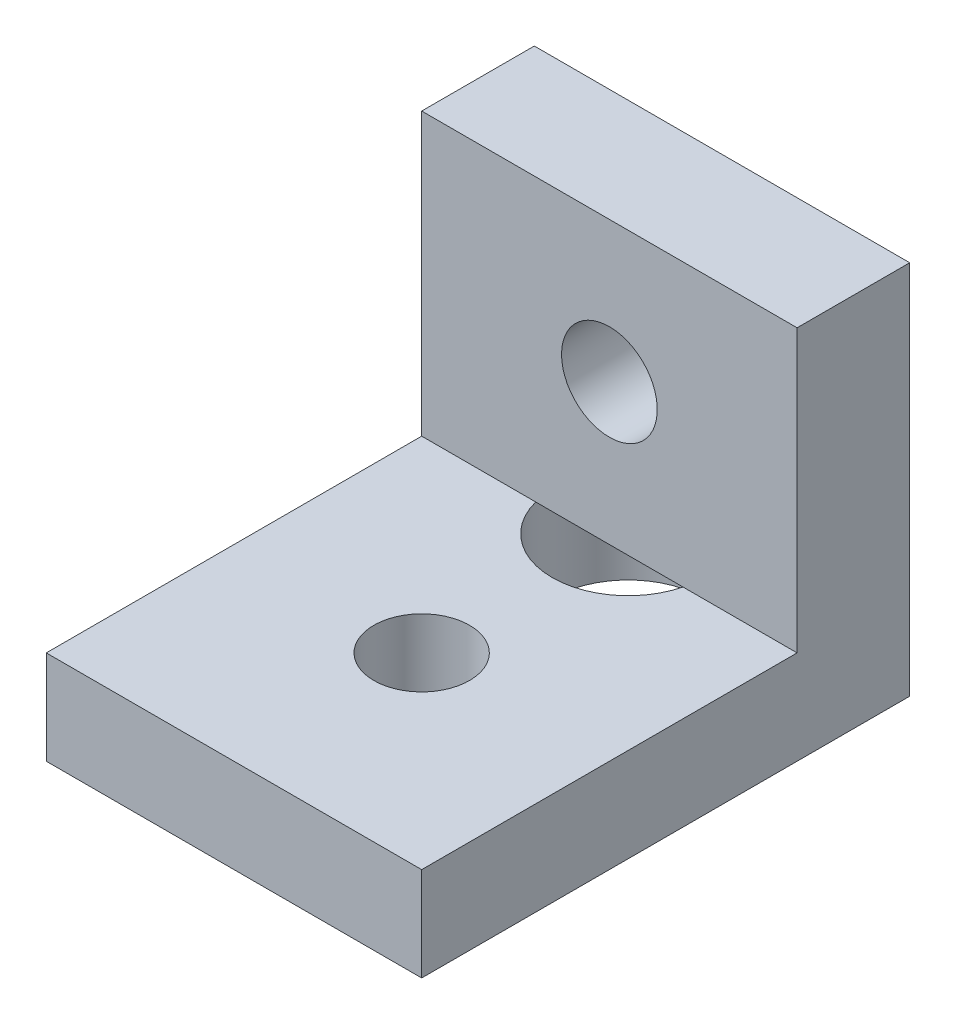
ISO-10303-21;
HEADER;
FILE_DESCRIPTION(('STEP AP214'),'2;1');
FILE_NAME('part.step','',(''),(''),'','','');
FILE_SCHEMA(('AUTOMOTIVE_DESIGN { 1 0 10303 214 1 1 1 1 }'));
ENDSEC;
DATA;
#1=APPLICATION_CONTEXT('core data for automotive mechanical design processes');
#2=APPLICATION_PROTOCOL_DEFINITION('international standard','automotive_design',2000,#1);
#3=PRODUCT_CONTEXT('',#1,'mechanical');
#4=PRODUCT('Part','Part','',(#3));
#5=PRODUCT_RELATED_PRODUCT_CATEGORY('part','',(#4));
#6=PRODUCT_DEFINITION_FORMATION('','',#4);
#7=PRODUCT_DEFINITION_CONTEXT('part definition',#1,'design');
#8=PRODUCT_DEFINITION('design','',#6,#7);
#9=PRODUCT_DEFINITION_SHAPE('','',#8);
#10=(LENGTH_UNIT() NAMED_UNIT(*) SI_UNIT(.MILLI.,.METRE.));
#11=(NAMED_UNIT(*) PLANE_ANGLE_UNIT() SI_UNIT($,.RADIAN.));
#12=(NAMED_UNIT(*) SI_UNIT($,.STERADIAN.) SOLID_ANGLE_UNIT());
#13=UNCERTAINTY_MEASURE_WITH_UNIT(LENGTH_MEASURE(1.E-05),#10,'distance_accuracy_value','');
#14=(GEOMETRIC_REPRESENTATION_CONTEXT(3) GLOBAL_UNCERTAINTY_ASSIGNED_CONTEXT((#13)) GLOBAL_UNIT_ASSIGNED_CONTEXT((#10,
#11,#12)) REPRESENTATION_CONTEXT('',''));
#15=CARTESIAN_POINT('',(0.,0.,0.));
#16=DIRECTION('',(0.,0.,1.));
#17=DIRECTION('',(1.,0.,0.));
#18=AXIS2_PLACEMENT_3D('',#15,#16,#17);
#19=CARTESIAN_POINT('',(10.,5.,-21.));
#20=DIRECTION('',(0.,-1.,0.));
#21=DIRECTION('',(0.,0.,-1.));
#22=AXIS2_PLACEMENT_3D('',#19,#20,#21);
#23=CYLINDRICAL_SURFACE('',#22,4.05);
#24=CARTESIAN_POINT('',(10.,0.,-21.));
#25=DIRECTION('',(0.,1.,0.));
#26=DIRECTION('',(0.,0.,1.));
#27=AXIS2_PLACEMENT_3D('',#24,#25,#26);
#28=CIRCLE('',#27,4.05);
#29=CARTESIAN_POINT('',(10.,0.,-16.95));
#30=VERTEX_POINT('',#29);
#31=EDGE_CURVE('E107',#30,#30,#28,.T.);
#32=ORIENTED_EDGE('',*,*,#31,.F.);
#33=EDGE_LOOP('',(#32));
#34=FACE_BOUND('',#33,.T.);
#35=CARTESIAN_POINT('',(10.,5.,-21.));
#36=DIRECTION('',(0.,1.,0.));
#37=DIRECTION('',(0.,0.,1.));
#38=AXIS2_PLACEMENT_3D('',#35,#36,#37);
#39=CIRCLE('',#38,4.05);
#40=CARTESIAN_POINT('',(6.07539810936192,5.,-20.));
#41=VERTEX_POINT('',#40);
#42=CARTESIAN_POINT('',(13.9246018906381,5.,-20.));
#43=VERTEX_POINT('',#42);
#44=EDGE_CURVE('E117',#41,#43,#39,.T.);
#45=ORIENTED_EDGE('',*,*,#44,.T.);
#46=CARTESIAN_POINT('',(10.,5.,-21.));
#47=DIRECTION('',(0.,1.,0.));
#48=DIRECTION('',(0.,0.,1.));
#49=AXIS2_PLACEMENT_3D('',#46,#47,#48);
#50=CIRCLE('',#49,4.05);
#51=EDGE_CURVE('E200',#43,#41,#50,.T.);
#52=ORIENTED_EDGE('',*,*,#51,.T.);
#53=EDGE_LOOP('',(#45,#52));
#54=FACE_BOUND('',#53,.T.);
#55=ADVANCED_FACE('F35',(#34,#54),#23,.F.);
#56=CARTESIAN_POINT('',(0.,5.,0.));
#57=DIRECTION('',(0.,1.,0.));
#58=DIRECTION('',(0.,0.,1.));
#59=AXIS2_PLACEMENT_3D('',#56,#57,#58);
#60=PLANE('',#59);
#61=CARTESIAN_POINT('',(10.,5.,-10.));
#62=DIRECTION('',(0.,1.,0.));
#63=DIRECTION('',(0.,0.,1.));
#64=AXIS2_PLACEMENT_3D('',#61,#62,#63);
#65=CIRCLE('',#64,2.55);
#66=CARTESIAN_POINT('',(10.,5.,-7.45));
#67=VERTEX_POINT('',#66);
#68=EDGE_CURVE('E101',#67,#67,#65,.T.);
#69=ORIENTED_EDGE('',*,*,#68,.F.);
#70=EDGE_LOOP('',(#69));
#71=FACE_BOUND('',#70,.T.);
#72=DIRECTION('',(0.,0.,-1.));
#73=VECTOR('',#72,1.);
#74=CARTESIAN_POINT('',(20.,5.,0.));
#75=LINE('',#74,#73);
#76=CARTESIAN_POINT('',(20.,5.,0.));
#77=VERTEX_POINT('',#76);
#78=CARTESIAN_POINT('',(20.,5.,-20.));
#79=VERTEX_POINT('',#78);
#80=EDGE_CURVE('E59',#77,#79,#75,.T.);
#81=ORIENTED_EDGE('',*,*,#80,.T.);
#82=DIRECTION('',(-1.,0.,0.));
#83=VECTOR('',#82,1.);
#84=CARTESIAN_POINT('',(0.,5.,-20.));
#85=LINE('',#84,#83);
#86=EDGE_CURVE('E111',#79,#43,#85,.T.);
#87=ORIENTED_EDGE('',*,*,#86,.T.);
#88=ORIENTED_EDGE('',*,*,#44,.F.);
#89=DIRECTION('',(-1.,0.,0.));
#90=VECTOR('',#89,1.);
#91=CARTESIAN_POINT('',(0.,5.,-20.));
#92=LINE('',#91,#90);
#93=CARTESIAN_POINT('',(0.,5.,-20.));
#94=VERTEX_POINT('',#93);
#95=EDGE_CURVE('E147',#41,#94,#92,.T.);
#96=ORIENTED_EDGE('',*,*,#95,.T.);
#97=DIRECTION('',(0.,0.,-1.));
#98=VECTOR('',#97,1.);
#99=CARTESIAN_POINT('',(0.,5.,0.));
#100=LINE('',#99,#98);
#101=CARTESIAN_POINT('',(0.,5.,0.));
#102=VERTEX_POINT('',#101);
#103=EDGE_CURVE('E153',#102,#94,#100,.T.);
#104=ORIENTED_EDGE('',*,*,#103,.F.);
#105=DIRECTION('',(1.,0.,0.));
#106=VECTOR('',#105,1.);
#107=CARTESIAN_POINT('',(0.,5.,0.));
#108=LINE('',#107,#106);
#109=EDGE_CURVE('E123',#102,#77,#108,.T.);
#110=ORIENTED_EDGE('',*,*,#109,.T.);
#111=EDGE_LOOP('',(#81,#87,#88,#96,#104,#110));
#112=FACE_BOUND('',#111,.T.);
#113=ADVANCED_FACE('F162',(#71,#112),#60,.T.);
#114=CARTESIAN_POINT('',(0.,5.,-26.));
#115=DIRECTION('',(0.,0.,-1.));
#116=DIRECTION('',(-1.,0.,0.));
#117=AXIS2_PLACEMENT_3D('',#114,#115,#116);
#118=PLANE('',#117);
#119=CARTESIAN_POINT('',(10.,12.5,-26.));
#120=DIRECTION('',(0.,0.,-1.));
#121=DIRECTION('',(-1.,0.,0.));
#122=AXIS2_PLACEMENT_3D('',#119,#120,#121);
#123=CIRCLE('',#122,2.55);
#124=CARTESIAN_POINT('',(7.45,12.5,-26.));
#125=VERTEX_POINT('',#124);
#126=EDGE_CURVE('E206',#125,#125,#123,.T.);
#127=ORIENTED_EDGE('',*,*,#126,.F.);
#128=EDGE_LOOP('',(#127));
#129=FACE_BOUND('',#128,.T.);
#130=DIRECTION('',(1.,0.,0.));
#131=VECTOR('',#130,1.);
#132=CARTESIAN_POINT('',(0.,0.,-26.));
#133=LINE('',#132,#131);
#134=CARTESIAN_POINT('',(0.,0.,-26.));
#135=VERTEX_POINT('',#134);
#136=CARTESIAN_POINT('',(20.,0.,-26.));
#137=VERTEX_POINT('',#136);
#138=EDGE_CURVE('E98',#135,#137,#133,.T.);
#139=ORIENTED_EDGE('',*,*,#138,.F.);
#140=DIRECTION('',(0.,-1.,0.));
#141=VECTOR('',#140,1.);
#142=CARTESIAN_POINT('',(0.,5.,-26.));
#143=LINE('',#142,#141);
#144=CARTESIAN_POINT('',(0.,20.,-26.));
#145=VERTEX_POINT('',#144);
#146=EDGE_CURVE('E11',#145,#135,#143,.T.);
#147=ORIENTED_EDGE('',*,*,#146,.F.);
#148=DIRECTION('',(1.,0.,0.));
#149=VECTOR('',#148,1.);
#150=CARTESIAN_POINT('',(0.,20.,-26.));
#151=LINE('',#150,#149);
#152=CARTESIAN_POINT('',(20.,20.,-26.));
#153=VERTEX_POINT('',#152);
#154=EDGE_CURVE('E100',#145,#153,#151,.T.);
#155=ORIENTED_EDGE('',*,*,#154,.T.);
#156=DIRECTION('',(0.,-1.,0.));
#157=VECTOR('',#156,1.);
#158=CARTESIAN_POINT('',(20.,5.,-26.));
#159=LINE('',#158,#157);
#160=EDGE_CURVE('E82',#153,#137,#159,.T.);
#161=ORIENTED_EDGE('',*,*,#160,.T.);
#162=EDGE_LOOP('',(#139,#147,#155,#161));
#163=FACE_BOUND('',#162,.T.);
#164=ADVANCED_FACE('F96',(#129,#163),#118,.T.);
#165=CARTESIAN_POINT('',(0.,5.,0.));
#166=DIRECTION('',(-1.,0.,0.));
#167=DIRECTION('',(0.,0.,1.));
#168=AXIS2_PLACEMENT_3D('',#165,#166,#167);
#169=PLANE('',#168);
#170=ORIENTED_EDGE('',*,*,#146,.T.);
#171=DIRECTION('',(0.,0.,-1.));
#172=VECTOR('',#171,1.);
#173=CARTESIAN_POINT('',(0.,0.,0.));
#174=LINE('',#173,#172);
#175=CARTESIAN_POINT('',(0.,0.,0.));
#176=VERTEX_POINT('',#175);
#177=EDGE_CURVE('E106',#176,#135,#174,.T.);
#178=ORIENTED_EDGE('',*,*,#177,.F.);
#179=DIRECTION('',(0.,-1.,0.));
#180=VECTOR('',#179,1.);
#181=CARTESIAN_POINT('',(0.,5.,0.));
#182=LINE('',#181,#180);
#183=EDGE_CURVE('E43',#102,#176,#182,.T.);
#184=ORIENTED_EDGE('',*,*,#183,.F.);
#185=ORIENTED_EDGE('',*,*,#103,.T.);
#186=DIRECTION('',(0.,-1.,0.));
#187=VECTOR('',#186,1.);
#188=CARTESIAN_POINT('',(0.,20.,-20.));
#189=LINE('',#188,#187);
#190=CARTESIAN_POINT('',(0.,20.,-20.));
#191=VERTEX_POINT('',#190);
#192=EDGE_CURVE('E50',#191,#94,#189,.T.);
#193=ORIENTED_EDGE('',*,*,#192,.F.);
#194=DIRECTION('',(0.,0.,-1.));
#195=VECTOR('',#194,1.);
#196=CARTESIAN_POINT('',(0.,20.,0.));
#197=LINE('',#196,#195);
#198=EDGE_CURVE('E131',#191,#145,#197,.T.);
#199=ORIENTED_EDGE('',*,*,#198,.T.);
#200=EDGE_LOOP('',(#170,#178,#184,#185,#193,#199));
#201=FACE_BOUND('',#200,.T.);
#202=ADVANCED_FACE('F127',(#201),#169,.T.);
#203=CARTESIAN_POINT('',(0.,5.,0.));
#204=DIRECTION('',(0.,0.,-1.));
#205=DIRECTION('',(-1.,0.,0.));
#206=AXIS2_PLACEMENT_3D('',#203,#204,#205);
#207=PLANE('',#206);
#208=DIRECTION('',(1.,0.,0.));
#209=VECTOR('',#208,1.);
#210=CARTESIAN_POINT('',(0.,0.,0.));
#211=LINE('',#210,#209);
#212=CARTESIAN_POINT('',(20.,0.,0.));
#213=VERTEX_POINT('',#212);
#214=EDGE_CURVE('E91',#176,#213,#211,.T.);
#215=ORIENTED_EDGE('',*,*,#214,.T.);
#216=DIRECTION('',(0.,-1.,0.));
#217=VECTOR('',#216,1.);
#218=CARTESIAN_POINT('',(20.,5.,0.));
#219=LINE('',#218,#217);
#220=EDGE_CURVE('E85',#77,#213,#219,.T.);
#221=ORIENTED_EDGE('',*,*,#220,.F.);
#222=ORIENTED_EDGE('',*,*,#109,.F.);
#223=ORIENTED_EDGE('',*,*,#183,.T.);
#224=EDGE_LOOP('',(#215,#221,#222,#223));
#225=FACE_BOUND('',#224,.T.);
#226=ADVANCED_FACE('F122',(#225),#207,.F.);
#227=CARTESIAN_POINT('',(20.,5.,0.));
#228=DIRECTION('',(-1.,0.,0.));
#229=DIRECTION('',(0.,0.,1.));
#230=AXIS2_PLACEMENT_3D('',#227,#228,#229);
#231=PLANE('',#230);
#232=ORIENTED_EDGE('',*,*,#160,.F.);
#233=DIRECTION('',(0.,0.,-1.));
#234=VECTOR('',#233,1.);
#235=CARTESIAN_POINT('',(20.,20.,0.));
#236=LINE('',#235,#234);
#237=CARTESIAN_POINT('',(20.,20.,-20.));
#238=VERTEX_POINT('',#237);
#239=EDGE_CURVE('E137',#238,#153,#236,.T.);
#240=ORIENTED_EDGE('',*,*,#239,.F.);
#241=DIRECTION('',(0.,-1.,0.));
#242=VECTOR('',#241,1.);
#243=CARTESIAN_POINT('',(20.,20.,-20.));
#244=LINE('',#243,#242);
#245=EDGE_CURVE('E145',#238,#79,#244,.T.);
#246=ORIENTED_EDGE('',*,*,#245,.T.);
#247=ORIENTED_EDGE('',*,*,#80,.F.);
#248=ORIENTED_EDGE('',*,*,#220,.T.);
#249=DIRECTION('',(0.,0.,-1.));
#250=VECTOR('',#249,1.);
#251=CARTESIAN_POINT('',(20.,0.,0.));
#252=LINE('',#251,#250);
#253=EDGE_CURVE('E77',#213,#137,#252,.T.);
#254=ORIENTED_EDGE('',*,*,#253,.T.);
#255=EDGE_LOOP('',(#232,#240,#246,#247,#248,#254));
#256=FACE_BOUND('',#255,.T.);
#257=ADVANCED_FACE('F79',(#256),#231,.F.);
#258=CARTESIAN_POINT('',(10.,5.,-10.));
#259=DIRECTION('',(0.,-1.,0.));
#260=DIRECTION('',(0.,0.,-1.));
#261=AXIS2_PLACEMENT_3D('',#258,#259,#260);
#262=CYLINDRICAL_SURFACE('',#261,2.55);
#263=ORIENTED_EDGE('',*,*,#68,.T.);
#264=EDGE_LOOP('',(#263));
#265=FACE_BOUND('',#264,.T.);
#266=CARTESIAN_POINT('',(10.,0.,-10.));
#267=DIRECTION('',(0.,1.,0.));
#268=DIRECTION('',(0.,0.,1.));
#269=AXIS2_PLACEMENT_3D('',#266,#267,#268);
#270=CIRCLE('',#269,2.55);
#271=CARTESIAN_POINT('',(10.,0.,-7.45));
#272=VERTEX_POINT('',#271);
#273=EDGE_CURVE('E90',#272,#272,#270,.T.);
#274=ORIENTED_EDGE('',*,*,#273,.F.);
#275=EDGE_LOOP('',(#274));
#276=FACE_BOUND('',#275,.T.);
#277=ADVANCED_FACE('F159',(#265,#276),#262,.F.);
#278=CARTESIAN_POINT('',(0.,0.,0.));
#279=DIRECTION('',(0.,1.,0.));
#280=DIRECTION('',(0.,0.,1.));
#281=AXIS2_PLACEMENT_3D('',#278,#279,#280);
#282=PLANE('',#281);
#283=ORIENTED_EDGE('',*,*,#31,.T.);
#284=EDGE_LOOP('',(#283));
#285=FACE_BOUND('',#284,.T.);
#286=ORIENTED_EDGE('',*,*,#138,.T.);
#287=ORIENTED_EDGE('',*,*,#253,.F.);
#288=ORIENTED_EDGE('',*,*,#214,.F.);
#289=ORIENTED_EDGE('',*,*,#177,.T.);
#290=EDGE_LOOP('',(#286,#287,#288,#289));
#291=FACE_BOUND('',#290,.T.);
#292=ORIENTED_EDGE('',*,*,#273,.T.);
#293=EDGE_LOOP('',(#292));
#294=FACE_BOUND('',#293,.T.);
#295=ADVANCED_FACE('F103',(#285,#291,#294),#282,.F.);
#296=CARTESIAN_POINT('',(0.,20.,-20.));
#297=DIRECTION('',(0.,0.,-1.));
#298=DIRECTION('',(-1.,0.,0.));
#299=AXIS2_PLACEMENT_3D('',#296,#297,#298);
#300=PLANE('',#299);
#301=CARTESIAN_POINT('',(10.,12.5,-20.));
#302=DIRECTION('',(0.,0.,-1.));
#303=DIRECTION('',(-1.,0.,0.));
#304=AXIS2_PLACEMENT_3D('',#301,#302,#303);
#305=CIRCLE('',#304,2.55);
#306=CARTESIAN_POINT('',(7.45,12.5,-20.));
#307=VERTEX_POINT('',#306);
#308=EDGE_CURVE('E38',#307,#307,#305,.T.);
#309=ORIENTED_EDGE('',*,*,#308,.T.);
#310=EDGE_LOOP('',(#309));
#311=FACE_BOUND('',#310,.T.);
#312=ORIENTED_EDGE('',*,*,#86,.F.);
#313=ORIENTED_EDGE('',*,*,#245,.F.);
#314=DIRECTION('',(1.,0.,0.));
#315=VECTOR('',#314,1.);
#316=CARTESIAN_POINT('',(0.,20.,-20.));
#317=LINE('',#316,#315);
#318=EDGE_CURVE('E140',#191,#238,#317,.T.);
#319=ORIENTED_EDGE('',*,*,#318,.F.);
#320=ORIENTED_EDGE('',*,*,#192,.T.);
#321=ORIENTED_EDGE('',*,*,#95,.F.);
#322=DIRECTION('',(-1.,0.,0.));
#323=VECTOR('',#322,1.);
#324=CARTESIAN_POINT('',(0.,5.,-20.));
#325=LINE('',#324,#323);
#326=EDGE_CURVE('E179',#43,#41,#325,.T.);
#327=ORIENTED_EDGE('',*,*,#326,.F.);
#328=EDGE_LOOP('',(#312,#313,#319,#320,#321,#327));
#329=FACE_BOUND('',#328,.T.);
#330=ADVANCED_FACE('F180',(#311,#329),#300,.F.);
#331=CARTESIAN_POINT('',(0.,20.,0.));
#332=DIRECTION('',(0.,1.,0.));
#333=DIRECTION('',(0.,0.,1.));
#334=AXIS2_PLACEMENT_3D('',#331,#332,#333);
#335=PLANE('',#334);
#336=ORIENTED_EDGE('',*,*,#198,.F.);
#337=ORIENTED_EDGE('',*,*,#318,.T.);
#338=ORIENTED_EDGE('',*,*,#239,.T.);
#339=ORIENTED_EDGE('',*,*,#154,.F.);
#340=EDGE_LOOP('',(#336,#337,#338,#339));
#341=FACE_BOUND('',#340,.T.);
#342=ADVANCED_FACE('F135',(#341),#335,.T.);
#343=CARTESIAN_POINT('',(0.,5.,0.));
#344=DIRECTION('',(0.,1.,0.));
#345=DIRECTION('',(0.,0.,1.));
#346=AXIS2_PLACEMENT_3D('',#343,#344,#345);
#347=PLANE('',#346);
#348=ORIENTED_EDGE('',*,*,#326,.T.);
#349=ORIENTED_EDGE('',*,*,#51,.F.);
#350=EDGE_LOOP('',(#348,#349));
#351=FACE_BOUND('',#350,.T.);
#352=ADVANCED_FACE('F188',(#351),#347,.F.);
#353=CARTESIAN_POINT('',(10.,12.5,0.));
#354=DIRECTION('',(0.,0.,-1.));
#355=DIRECTION('',(-1.,0.,0.));
#356=AXIS2_PLACEMENT_3D('',#353,#354,#355);
#357=CYLINDRICAL_SURFACE('',#356,2.55);
#358=CARTESIAN_POINT('',(7.45,12.5,-26.));
#359=CARTESIAN_POINT('',(7.45,12.5,-25.9375));
#360=CARTESIAN_POINT('',(7.45,12.5,-25.875));
#361=CARTESIAN_POINT('',(7.45,12.5,-25.75));
#362=CARTESIAN_POINT('',(7.45,12.5,-25.6875));
#363=CARTESIAN_POINT('',(7.45,12.5,-25.5625));
#364=CARTESIAN_POINT('',(7.45,12.5,-25.5));
#365=CARTESIAN_POINT('',(7.45,12.5,-25.375));
#366=CARTESIAN_POINT('',(7.45,12.5,-25.3125));
#367=CARTESIAN_POINT('',(7.45,12.5,-25.1875));
#368=CARTESIAN_POINT('',(7.45,12.5,-25.125));
#369=CARTESIAN_POINT('',(7.45,12.5,-25.));
#370=CARTESIAN_POINT('',(7.45,12.5,-24.9375));
#371=CARTESIAN_POINT('',(7.45,12.5,-24.8125));
#372=CARTESIAN_POINT('',(7.45,12.5,-24.75));
#373=CARTESIAN_POINT('',(7.45,12.5,-24.625));
#374=CARTESIAN_POINT('',(7.45,12.5,-24.5625));
#375=CARTESIAN_POINT('',(7.45,12.5,-24.4375));
#376=CARTESIAN_POINT('',(7.45,12.5,-24.375));
#377=CARTESIAN_POINT('',(7.45,12.5,-24.25));
#378=CARTESIAN_POINT('',(7.45,12.5,-24.1875));
#379=CARTESIAN_POINT('',(7.45,12.5,-24.0625));
#380=CARTESIAN_POINT('',(7.45,12.5,-24.));
#381=CARTESIAN_POINT('',(7.45,12.5,-23.875));
#382=CARTESIAN_POINT('',(7.45,12.5,-23.8125));
#383=CARTESIAN_POINT('',(7.45,12.5,-23.6875));
#384=CARTESIAN_POINT('',(7.45,12.5,-23.625));
#385=CARTESIAN_POINT('',(7.45,12.5,-23.5));
#386=CARTESIAN_POINT('',(7.45,12.5,-23.4375));
#387=CARTESIAN_POINT('',(7.45,12.5,-23.3125));
#388=CARTESIAN_POINT('',(7.45,12.5,-23.25));
#389=CARTESIAN_POINT('',(7.45,12.5,-23.125));
#390=CARTESIAN_POINT('',(7.45,12.5,-23.0625));
#391=CARTESIAN_POINT('',(7.45,12.5,-22.9375));
#392=CARTESIAN_POINT('',(7.45,12.5,-22.875));
#393=CARTESIAN_POINT('',(7.45,12.5,-22.75));
#394=CARTESIAN_POINT('',(7.45,12.5,-22.6875));
#395=CARTESIAN_POINT('',(7.45,12.5,-22.5625));
#396=CARTESIAN_POINT('',(7.45,12.5,-22.5));
#397=CARTESIAN_POINT('',(7.45,12.5,-22.375));
#398=CARTESIAN_POINT('',(7.45,12.5,-22.3125));
#399=CARTESIAN_POINT('',(7.45,12.5,-22.1875));
#400=CARTESIAN_POINT('',(7.45,12.5,-22.125));
#401=CARTESIAN_POINT('',(7.45,12.5,-22.));
#402=CARTESIAN_POINT('',(7.45,12.5,-21.9375));
#403=CARTESIAN_POINT('',(7.45,12.5,-21.8125));
#404=CARTESIAN_POINT('',(7.45,12.5,-21.75));
#405=CARTESIAN_POINT('',(7.45,12.5,-21.625));
#406=CARTESIAN_POINT('',(7.45,12.5,-21.5625));
#407=CARTESIAN_POINT('',(7.45,12.5,-21.4375));
#408=CARTESIAN_POINT('',(7.45,12.5,-21.375));
#409=CARTESIAN_POINT('',(7.45,12.5,-21.25));
#410=CARTESIAN_POINT('',(7.45,12.5,-21.1875));
#411=CARTESIAN_POINT('',(7.45,12.5,-21.0625));
#412=CARTESIAN_POINT('',(7.45,12.5,-21.));
#413=CARTESIAN_POINT('',(7.45,12.5,-20.875));
#414=CARTESIAN_POINT('',(7.45,12.5,-20.8125));
#415=CARTESIAN_POINT('',(7.45,12.5,-20.6875));
#416=CARTESIAN_POINT('',(7.45,12.5,-20.625));
#417=CARTESIAN_POINT('',(7.45,12.5,-20.5));
#418=CARTESIAN_POINT('',(7.45,12.5,-20.4375));
#419=CARTESIAN_POINT('',(7.45,12.5,-20.3125));
#420=CARTESIAN_POINT('',(7.45,12.5,-20.25));
#421=CARTESIAN_POINT('',(7.45,12.5,-20.125));
#422=CARTESIAN_POINT('',(7.45,12.5,-20.0625));
#423=CARTESIAN_POINT('',(7.45,12.5,-20.));
#424=B_SPLINE_CURVE_WITH_KNOTS('',3,(#358,#359,#360,#361,#362,#363,#364,#365,#366,#367,#368,
#369,#370,#371,#372,#373,#374,#375,#376,#377,#378,#379,#380,#381,#382,#383,#384,#385,#386,#387,
#388,#389,#390,#391,#392,#393,#394,#395,#396,#397,#398,#399,#400,#401,#402,#403,#404,#405,#406,
#407,#408,#409,#410,#411,#412,#413,#414,#415,#416,#417,#418,#419,#420,#421,#422,#423),
.UNSPECIFIED.,.F.,.F.,(4,2,2,2,2,2,2,2,2,2,2,2,2,2,2,2,2,2,2,2,2,2,2,2,2,2,2,2,2,2,2,2,4),(0.,
0.1875,0.375,0.5625,0.750000000000001,0.937500000000001,1.125,1.3125,1.5,1.6875,1.875,2.0625,
2.25,2.4375,2.625,2.8125,3.,3.1875,3.375,3.5625,3.75,3.9375,4.125,4.3125,4.5,4.6875,4.875,
5.0625,5.25,5.4375,5.625,5.8125,6.),.UNSPECIFIED.);
#425=EDGE_CURVE('BSEAM212',#125,#307,#424,.T.);
#426=ORIENTED_EDGE('',*,*,#126,.T.);
#427=ORIENTED_EDGE('',*,*,#308,.F.);
#428=ORIENTED_EDGE('',*,*,#425,.T.);
#429=ORIENTED_EDGE('',*,*,#425,.F.);
#430=EDGE_LOOP('',(#426,#428,#427,#429));
#431=FACE_BOUND('',#430,.T.);
#432=ADVANCED_FACE('F212',(#431),#357,.F.);
#433=CLOSED_SHELL('',(#55,#113,#164,#202,#226,#257,#277,#295,#330,#342,#352,#432));
#434=MANIFOLD_SOLID_BREP('B2',#433);
#435=ADVANCED_BREP_SHAPE_REPRESENTATION('',(#18,#434),#14);
#436=SHAPE_DEFINITION_REPRESENTATION(#9,#435);
ENDSEC;
END-ISO-10303-21;
